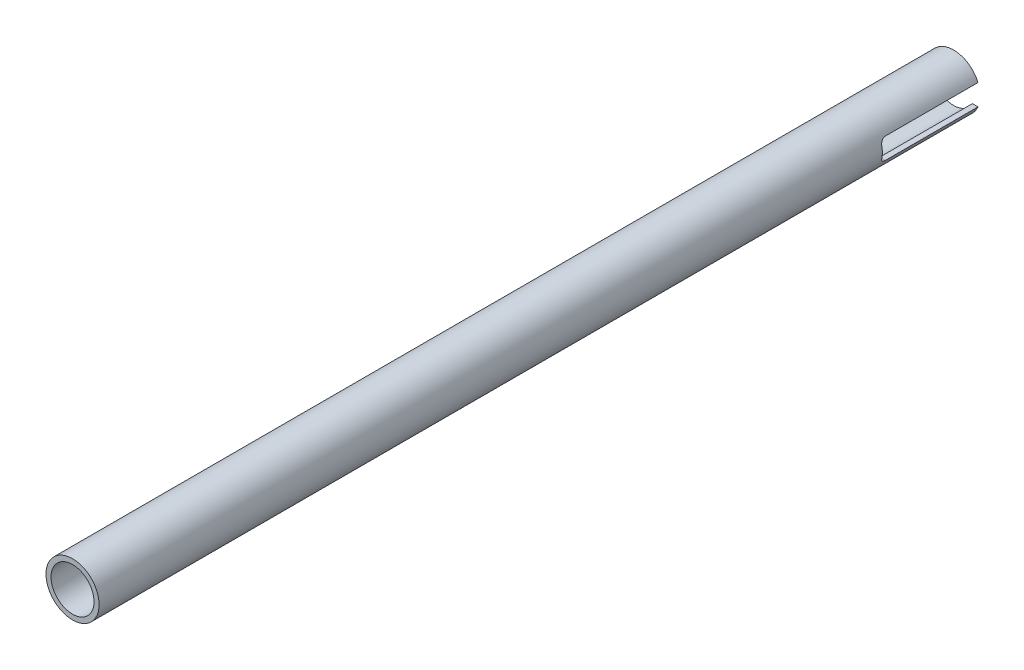
ISO-10303-21;
HEADER;
FILE_DESCRIPTION(('STEP AP214'),'2;1');
FILE_NAME('part.step','',(''),(''),'','','');
FILE_SCHEMA(('AUTOMOTIVE_DESIGN { 1 0 10303 214 1 1 1 1 }'));
ENDSEC;
DATA;
#1=APPLICATION_CONTEXT('core data for automotive mechanical design processes');
#2=APPLICATION_PROTOCOL_DEFINITION('international standard','automotive_design',2000,#1);
#3=PRODUCT_CONTEXT('',#1,'mechanical');
#4=PRODUCT('Part','Part','',(#3));
#5=PRODUCT_RELATED_PRODUCT_CATEGORY('part','',(#4));
#6=PRODUCT_DEFINITION_FORMATION('','',#4);
#7=PRODUCT_DEFINITION_CONTEXT('part definition',#1,'design');
#8=PRODUCT_DEFINITION('design','',#6,#7);
#9=PRODUCT_DEFINITION_SHAPE('','',#8);
#10=(LENGTH_UNIT() NAMED_UNIT(*) SI_UNIT(.MILLI.,.METRE.));
#11=(NAMED_UNIT(*) PLANE_ANGLE_UNIT() SI_UNIT($,.RADIAN.));
#12=(NAMED_UNIT(*) SI_UNIT($,.STERADIAN.) SOLID_ANGLE_UNIT());
#13=UNCERTAINTY_MEASURE_WITH_UNIT(LENGTH_MEASURE(1.E-05),#10,'distance_accuracy_value','');
#14=(GEOMETRIC_REPRESENTATION_CONTEXT(3) GLOBAL_UNCERTAINTY_ASSIGNED_CONTEXT((#13)) GLOBAL_UNIT_ASSIGNED_CONTEXT((#10,
#11,#12)) REPRESENTATION_CONTEXT('',''));
#15=CARTESIAN_POINT('',(0.,0.,0.));
#16=DIRECTION('',(0.,0.,1.));
#17=DIRECTION('',(1.,0.,0.));
#18=AXIS2_PLACEMENT_3D('',#15,#16,#17);
#19=CARTESIAN_POINT('',(0.,0.,0.));
#20=DIRECTION('',(0.,0.,1.));
#21=DIRECTION('',(1.,0.,0.));
#22=AXIS2_PLACEMENT_3D('',#19,#20,#21);
#23=PLANE('',#22);
#24=DIRECTION('',(-1.,0.,0.));
#25=VECTOR('',#24,1.);
#26=CARTESIAN_POINT('',(342.992458846044,-3.17500000000001,0.));
#27=LINE('',#26,#25);
#28=CARTESIAN_POINT('',(7.34407080575888,-3.17500000000001,0.));
#29=VERTEX_POINT('',#28);
#30=CARTESIAN_POINT('',(5.64543213580679,-3.17499999999999,0.));
#31=VERTEX_POINT('',#30);
#32=EDGE_CURVE('E63',#29,#31,#27,.T.);
#33=ORIENTED_EDGE('',*,*,#32,.F.);
#34=CARTESIAN_POINT('',(0.,0.,0.));
#35=DIRECTION('',(0.,0.,1.));
#36=DIRECTION('',(1.,0.,0.));
#37=AXIS2_PLACEMENT_3D('',#34,#35,#36);
#38=CIRCLE('',#37,8.001);
#39=CARTESIAN_POINT('',(-7.34407080575888,-3.17500000000001,0.));
#40=VERTEX_POINT('',#39);
#41=EDGE_CURVE('E152',#40,#29,#38,.T.);
#42=ORIENTED_EDGE('',*,*,#41,.F.);
#43=CARTESIAN_POINT('',(-5.64543213580682,-3.17500000000001,0.));
#44=VERTEX_POINT('',#43);
#45=EDGE_CURVE('E146',#44,#40,#27,.T.);
#46=ORIENTED_EDGE('',*,*,#45,.F.);
#47=CARTESIAN_POINT('',(0.,0.,0.));
#48=DIRECTION('',(0.,0.,1.));
#49=DIRECTION('',(1.,0.,0.));
#50=AXIS2_PLACEMENT_3D('',#47,#48,#49);
#51=CIRCLE('',#50,6.477);
#52=EDGE_CURVE('E248',#44,#31,#51,.T.);
#53=ORIENTED_EDGE('',*,*,#52,.T.);
#54=EDGE_LOOP('',(#33,#42,#46,#53));
#55=FACE_BOUND('',#54,.T.);
#56=ADVANCED_FACE('F39',(#55),#23,.F.);
#57=CARTESIAN_POINT('',(0.,0.,265.43));
#58=DIRECTION('',(0.,0.,-1.));
#59=DIRECTION('',(-1.,0.,0.));
#60=AXIS2_PLACEMENT_3D('',#57,#58,#59);
#61=CYLINDRICAL_SURFACE('',#60,8.001);
#62=CARTESIAN_POINT('',(0.,0.,265.43));
#63=DIRECTION('',(0.,0.,1.));
#64=DIRECTION('',(1.,0.,0.));
#65=AXIS2_PLACEMENT_3D('',#62,#63,#64);
#66=CIRCLE('',#65,8.001);
#67=CARTESIAN_POINT('',(8.001,0.,265.43));
#68=VERTEX_POINT('',#67);
#69=EDGE_CURVE('E255',#68,#68,#66,.T.);
#70=ORIENTED_EDGE('',*,*,#69,.F.);
#71=EDGE_LOOP('',(#70));
#72=FACE_BOUND('',#71,.T.);
#73=DIRECTION('',(0.,0.,-1.));
#74=VECTOR('',#73,1.);
#75=CARTESIAN_POINT('',(7.34407080575892,3.17499999999992,265.43));
#76=LINE('',#75,#74);
#77=CARTESIAN_POINT('',(7.34407080575894,3.175,0.));
#78=VERTEX_POINT('',#77);
#79=CARTESIAN_POINT('',(7.34407080575889,3.17499999999999,27.94));
#80=VERTEX_POINT('',#79);
#81=EDGE_CURVE('E244',#78,#80,#76,.F.);
#82=ORIENTED_EDGE('',*,*,#81,.F.);
#83=CARTESIAN_POINT('',(-7.34407080575894,3.175,0.));
#84=VERTEX_POINT('',#83);
#85=EDGE_CURVE('E259',#78,#84,#38,.T.);
#86=ORIENTED_EDGE('',*,*,#85,.T.);
#87=DIRECTION('',(0.,0.,-1.));
#88=VECTOR('',#87,1.);
#89=CARTESIAN_POINT('',(-7.34407080575892,3.17499999999992,265.43));
#90=LINE('',#89,#88);
#91=CARTESIAN_POINT('',(-7.34407080575889,3.17499999999999,27.94));
#92=VERTEX_POINT('',#91);
#93=EDGE_CURVE('E246',#92,#84,#90,.T.);
#94=ORIENTED_EDGE('',*,*,#93,.F.);
#95=CARTESIAN_POINT('',(-7.8288057837706,1.65099999999999,29.464));
#96=CARTESIAN_POINT('',(-7.81947795268345,1.69524181564514,29.4639996807889));
#97=CARTESIAN_POINT('',(-7.80977555287386,1.73937906238703,29.4620725755956));
#98=CARTESIAN_POINT('',(-7.7897053190962,1.82715995012294,29.4544259194222));
#99=CARTESIAN_POINT('',(-7.77933765259943,1.870803712116,29.4487073195399));
#100=CARTESIAN_POINT('',(-7.74740781787862,2.00038689143379,29.4259920832168));
#101=CARTESIAN_POINT('',(-7.72497172734663,2.08520038066884,29.4034353611242));
#102=CARTESIAN_POINT('',(-7.67879255624773,2.24931803273243,29.3443529357356));
#103=CARTESIAN_POINT('',(-7.65505009243317,2.32862475603218,29.307833776622));
#104=CARTESIAN_POINT('',(-7.60739952527334,2.47987144136615,29.2218403935313));
#105=CARTESIAN_POINT('',(-7.58349136309819,2.55180862700726,29.1723613118312));
#106=CARTESIAN_POINT('',(-7.53640113822511,2.68773877112478,29.0605553900397));
#107=CARTESIAN_POINT('',(-7.51324222932275,2.75155008701076,28.9979974672164));
#108=CARTESIAN_POINT('',(-7.46969556535498,2.86766507697724,28.8621080561482));
#109=CARTESIAN_POINT('',(-7.44930787514765,2.91996848174228,28.7887763158346));
#110=CARTESIAN_POINT('',(-7.41339882631975,3.00995182097469,28.635356056821));
#111=CARTESIAN_POINT('',(-7.39775949227146,3.04799299625044,28.555507568052));
#112=CARTESIAN_POINT('',(-7.37198636942665,3.10981595853761,28.3896963126839));
#113=CARTESIAN_POINT('',(-7.36184321814923,3.13362200161646,28.3037442276388));
#114=CARTESIAN_POINT('',(-7.35134082404798,3.15814271182933,28.170748149592));
#115=CARTESIAN_POINT('',(-7.34862226710174,3.16445643648463,28.1248527548858));
#116=CARTESIAN_POINT('',(-7.34498545577234,3.17288497032065,28.0326477775769));
#117=CARTESIAN_POINT('',(-7.34406565426136,3.17500338794749,27.9863385853611));
#118=CARTESIAN_POINT('',(-7.34407080575889,3.17499999999999,27.94));
#119=B_SPLINE_CURVE_WITH_KNOTS('',3,(#95,#96,#97,#98,#99,#100,#101,#102,#103,#104,#105,#106,
#107,#108,#109,#110,#111,#112,#113,#114,#115,#116,#117,#118),.UNSPECIFIED.,.F.,.F.,(4,2,2,2,2,2,
2,2,2,2,2,4),(0.,0.135553024626245,0.271072058592374,0.541437670457962,0.811676717226676,
1.08201720207601,1.35761362878683,1.63321650449497,1.90127196271359,2.16886935439239,
2.30789050122071,2.44679202186551),.UNSPECIFIED.);
#120=CARTESIAN_POINT('',(-7.8288057837706,1.65099999999999,29.464));
#121=VERTEX_POINT('',#120);
#122=EDGE_CURVE('E232',#121,#92,#119,.T.);
#123=ORIENTED_EDGE('',*,*,#122,.F.);
#124=CARTESIAN_POINT('',(0.,0.,29.464));
#125=DIRECTION('',(0.,0.,-1.));
#126=DIRECTION('',(-1.,0.,0.));
#127=AXIS2_PLACEMENT_3D('',#124,#125,#126);
#128=CIRCLE('',#127,8.001);
#129=CARTESIAN_POINT('',(-7.8288057837706,-1.651,29.464));
#130=VERTEX_POINT('',#129);
#131=EDGE_CURVE('E140',#130,#121,#128,.T.);
#132=ORIENTED_EDGE('',*,*,#131,.F.);
#133=CARTESIAN_POINT('',(-7.34407080575888,-3.175,27.94));
#134=CARTESIAN_POINT('',(-7.3440680096913,-3.17500157818638,27.9806984476088));
#135=CARTESIAN_POINT('',(-7.34477630214677,-3.17336860893187,28.0213759502433));
#136=CARTESIAN_POINT('',(-7.34758309143993,-3.16686635956913,28.102411407968));
#137=CARTESIAN_POINT('',(-7.34968118035477,-3.16199802907896,28.1427694533067));
#138=CARTESIAN_POINT('',(-7.35798857580184,-3.14264423927033,28.2626338560667));
#139=CARTESIAN_POINT('',(-7.36621159330718,-3.12340930879257,28.3412906881812));
#140=CARTESIAN_POINT('',(-7.38735918413182,-3.07305366060584,28.4938993996992));
#141=CARTESIAN_POINT('',(-7.40028060607282,-3.04194090905529,28.567854393813));
#142=CARTESIAN_POINT('',(-7.4298815779994,-2.96890708335138,28.7094453435949));
#143=CARTESIAN_POINT('',(-7.44656372650464,-2.92697853298672,28.7770768840646));
#144=CARTESIAN_POINT('',(-7.48338951433548,-2.83153727514407,28.9073193992745));
#145=CARTESIAN_POINT('',(-7.5036517696014,-2.77760154335605,28.9695861247467));
#146=CARTESIAN_POINT('',(-7.54586923311684,-2.66077336101834,29.0843978381578));
#147=CARTESIAN_POINT('',(-7.56782510086072,-2.59787741319581,29.1369390116058));
#148=CARTESIAN_POINT('',(-7.61377353576087,-2.46009532987571,29.23442490565));
#149=CARTESIAN_POINT('',(-7.63780327629239,-2.38468542927396,29.278613263246));
#150=CARTESIAN_POINT('',(-7.68517828309943,-2.22728162943213,29.3535295949975));
#151=CARTESIAN_POINT('',(-7.70852388215322,-2.14529100625114,29.3842642181982));
#152=CARTESIAN_POINT('',(-7.74866065435345,-1.99473307846588,29.4263269168587));
#153=CARTESIAN_POINT('',(-7.76579152458538,-1.9270088220366,29.4403889784846));
#154=CARTESIAN_POINT('',(-7.79853598216448,-1.78994063052702,29.4592336722557));
#155=CARTESIAN_POINT('',(-7.81414985826825,-1.7205970068191,29.4640180736839));
#156=CARTESIAN_POINT('',(-7.8288057837706,-1.651,29.464));
#157=B_SPLINE_CURVE_WITH_KNOTS('',3,(#133,#134,#135,#136,#137,#138,#139,#140,#141,#142,#143,
#144,#145,#146,#147,#148,#149,#150,#151,#152,#153,#154,#155,#156),.UNSPECIFIED.,.F.,.F.,(4,2,2,
2,2,2,2,2,2,2,2,4),(0.,0.12201561431295,0.243995431359554,0.486888996424004,0.729619944201783,
0.972519126749115,1.225937118326,1.47945429417213,1.75015649231414,2.02072475374975,
2.23388433321155,2.44700325838137),.UNSPECIFIED.);
#158=CARTESIAN_POINT('',(-7.34407080575888,-3.175,27.94));
#159=VERTEX_POINT('',#158);
#160=EDGE_CURVE('E141',#159,#130,#157,.T.);
#161=ORIENTED_EDGE('',*,*,#160,.F.);
#162=DIRECTION('',(0.,0.,-1.));
#163=VECTOR('',#162,1.);
#164=CARTESIAN_POINT('',(-7.34407080575889,-3.17499999999999,265.43));
#165=LINE('',#164,#163);
#166=EDGE_CURVE('E153',#40,#159,#165,.F.);
#167=ORIENTED_EDGE('',*,*,#166,.F.);
#168=ORIENTED_EDGE('',*,*,#41,.T.);
#169=DIRECTION('',(0.,0.,-1.));
#170=VECTOR('',#169,1.);
#171=CARTESIAN_POINT('',(7.34407080575889,-3.17499999999999,265.43));
#172=LINE('',#171,#170);
#173=CARTESIAN_POINT('',(7.34407080575888,-3.175,27.94));
#174=VERTEX_POINT('',#173);
#175=EDGE_CURVE('E144',#174,#29,#172,.T.);
#176=ORIENTED_EDGE('',*,*,#175,.F.);
#177=CARTESIAN_POINT('',(7.8288057837706,-1.651,29.464));
#178=CARTESIAN_POINT('',(7.81947795268344,-1.69524181564515,29.4639996807889));
#179=CARTESIAN_POINT('',(7.80977555287386,-1.73937906238705,29.4620725755956));
#180=CARTESIAN_POINT('',(7.78970531909619,-1.82715995012295,29.4544259194222));
#181=CARTESIAN_POINT('',(7.77933765259943,-1.87080371211601,29.4487073195399));
#182=CARTESIAN_POINT('',(7.74740781787862,-2.0003868914338,29.4259920832168));
#183=CARTESIAN_POINT('',(7.72497172734662,-2.08520038066886,29.4034353611242));
#184=CARTESIAN_POINT('',(7.67879255624773,-2.24931803273244,29.3443529357356));
#185=CARTESIAN_POINT('',(7.65505009243317,-2.32862475603219,29.307833776622));
#186=CARTESIAN_POINT('',(7.60739952527334,-2.47987144136616,29.2218403935313));
#187=CARTESIAN_POINT('',(7.58349136309819,-2.55180862700727,29.1723613118312));
#188=CARTESIAN_POINT('',(7.5364011382251,-2.6877387711248,29.0605553900397));
#189=CARTESIAN_POINT('',(7.51324222932275,-2.75155008701078,28.9979974672164));
#190=CARTESIAN_POINT('',(7.46969556535497,-2.86766507697726,28.8621080561482));
#191=CARTESIAN_POINT('',(7.44930787514765,-2.9199684817423,28.7887763158346));
#192=CARTESIAN_POINT('',(7.41339882631975,-3.0099518209747,28.635356056821));
#193=CARTESIAN_POINT('',(7.39775949227145,-3.04799299625045,28.555507568052));
#194=CARTESIAN_POINT('',(7.37198636942665,-3.10981595853763,28.3896963126839));
#195=CARTESIAN_POINT('',(7.36184321814923,-3.13362200161647,28.3037442276388));
#196=CARTESIAN_POINT('',(7.35134082404798,-3.15814271182935,28.170748149592));
#197=CARTESIAN_POINT('',(7.34862226710173,-3.16445643648464,28.1248527548858));
#198=CARTESIAN_POINT('',(7.34498545577233,-3.17288497032067,28.0326477775769));
#199=CARTESIAN_POINT('',(7.34406565426135,-3.17500338794751,27.9863385853611));
#200=CARTESIAN_POINT('',(7.34407080575888,-3.175,27.94));
#201=B_SPLINE_CURVE_WITH_KNOTS('',3,(#177,#178,#179,#180,#181,#182,#183,#184,#185,#186,#187,
#188,#189,#190,#191,#192,#193,#194,#195,#196,#197,#198,#199,#200),.UNSPECIFIED.,.F.,.F.,(4,2,2,
2,2,2,2,2,2,2,2,4),(0.,0.135553024626244,0.271072058592373,0.541437670457962,0.811676717226674,
1.08201720207601,1.35761362878684,1.63321650449498,1.9012719627136,2.16886935439239,
2.30789050122071,2.44679202186551),.UNSPECIFIED.);
#202=CARTESIAN_POINT('',(7.8288057837706,-1.651,29.464));
#203=VERTEX_POINT('',#202);
#204=EDGE_CURVE('E130',#203,#174,#201,.T.);
#205=ORIENTED_EDGE('',*,*,#204,.F.);
#206=CARTESIAN_POINT('',(7.8288057837706,1.65099999999999,29.464));
#207=VERTEX_POINT('',#206);
#208=EDGE_CURVE('E238',#207,#203,#128,.T.);
#209=ORIENTED_EDGE('',*,*,#208,.F.);
#210=CARTESIAN_POINT('',(7.34407080575889,3.17499999999999,27.94));
#211=CARTESIAN_POINT('',(7.34406800969131,3.17500157818637,27.9806984476088));
#212=CARTESIAN_POINT('',(7.34477630214678,3.17336860893186,28.0213759502433));
#213=CARTESIAN_POINT('',(7.34758309143993,3.16686635956911,28.102411407968));
#214=CARTESIAN_POINT('',(7.34968118035478,3.16199802907895,28.1427694533067));
#215=CARTESIAN_POINT('',(7.35798857580184,3.14264423927032,28.2626338560667));
#216=CARTESIAN_POINT('',(7.36621159330719,3.12340930879256,28.3412906881812));
#217=CARTESIAN_POINT('',(7.38735918413182,3.07305366060582,28.4938993996992));
#218=CARTESIAN_POINT('',(7.40028060607282,3.04194090905528,28.567854393813));
#219=CARTESIAN_POINT('',(7.4298815779994,2.96890708335136,28.7094453435949));
#220=CARTESIAN_POINT('',(7.44656372650465,2.92697853298671,28.7770768840646));
#221=CARTESIAN_POINT('',(7.48338951433549,2.83153727514406,28.9073193992745));
#222=CARTESIAN_POINT('',(7.50365176960141,2.77760154335604,28.9695861247467));
#223=CARTESIAN_POINT('',(7.54586923311685,2.66077336101832,29.0843978381578));
#224=CARTESIAN_POINT('',(7.56782510086072,2.5978774131958,29.1369390116058));
#225=CARTESIAN_POINT('',(7.61377353576087,2.4600953298757,29.23442490565));
#226=CARTESIAN_POINT('',(7.6378032762924,2.38468542927395,29.278613263246));
#227=CARTESIAN_POINT('',(7.68517828309944,2.22728162943211,29.3535295949975));
#228=CARTESIAN_POINT('',(7.70852388215323,2.14529100625113,29.3842642181981));
#229=CARTESIAN_POINT('',(7.74866065435345,1.99473307846587,29.4263269168587));
#230=CARTESIAN_POINT('',(7.76579152458538,1.92700882203658,29.4403889784846));
#231=CARTESIAN_POINT('',(7.79853598216448,1.78994063052701,29.4592336722557));
#232=CARTESIAN_POINT('',(7.81414985826825,1.72059700681908,29.4640180736839));
#233=CARTESIAN_POINT('',(7.8288057837706,1.65099999999999,29.464));
#234=B_SPLINE_CURVE_WITH_KNOTS('',3,(#210,#211,#212,#213,#214,#215,#216,#217,#218,#219,#220,
#221,#222,#223,#224,#225,#226,#227,#228,#229,#230,#231,#232,#233),.UNSPECIFIED.,.F.,.F.,(4,2,2,
2,2,2,2,2,2,2,2,4),(0.,0.12201561431295,0.243995431359554,0.486888996424004,0.729619944201783,
0.972519126749115,1.22593711832599,1.47945429417213,1.75015649231413,2.02072475374975,
2.23388433321155,2.44700325838137),.UNSPECIFIED.);
#235=EDGE_CURVE('E237',#80,#207,#234,.T.);
#236=ORIENTED_EDGE('',*,*,#235,.F.);
#237=EDGE_LOOP('',(#82,#86,#94,#123,#132,#161,#167,#168,#176,#205,#209,#236));
#238=FACE_BOUND('',#237,.T.);
#239=ADVANCED_FACE('F41',(#72,#238),#61,.T.);
#240=CARTESIAN_POINT('',(0.,0.,265.43));
#241=DIRECTION('',(0.,0.,-1.));
#242=DIRECTION('',(-1.,0.,0.));
#243=AXIS2_PLACEMENT_3D('',#240,#241,#242);
#244=CYLINDRICAL_SURFACE('',#243,6.477);
#245=CARTESIAN_POINT('',(0.,0.,265.43));
#246=DIRECTION('',(0.,0.,1.));
#247=DIRECTION('',(1.,0.,0.));
#248=AXIS2_PLACEMENT_3D('',#245,#246,#247);
#249=CIRCLE('',#248,6.477);
#250=CARTESIAN_POINT('',(6.477,0.,265.43));
#251=VERTEX_POINT('',#250);
#252=EDGE_CURVE('E249',#251,#251,#249,.T.);
#253=ORIENTED_EDGE('',*,*,#252,.T.);
#254=EDGE_LOOP('',(#253));
#255=FACE_BOUND('',#254,.T.);
#256=CARTESIAN_POINT('',(5.64543213580682,3.175,0.));
#257=VERTEX_POINT('',#256);
#258=CARTESIAN_POINT('',(-5.64543213580682,3.175,0.));
#259=VERTEX_POINT('',#258);
#260=EDGE_CURVE('E252',#257,#259,#51,.T.);
#261=ORIENTED_EDGE('',*,*,#260,.F.);
#262=DIRECTION('',(0.,0.,-1.));
#263=VECTOR('',#262,1.);
#264=CARTESIAN_POINT('',(5.64543213580683,3.17499999999992,265.43));
#265=LINE('',#264,#263);
#266=CARTESIAN_POINT('',(5.64543213580679,3.17499999999999,27.94));
#267=VERTEX_POINT('',#266);
#268=EDGE_CURVE('E11',#257,#267,#265,.F.);
#269=ORIENTED_EDGE('',*,*,#268,.T.);
#270=CARTESIAN_POINT('',(5.64543213580679,3.17499999999999,27.94));
#271=CARTESIAN_POINT('',(5.64542798532432,3.17500253012491,27.9795022750384));
#272=CARTESIAN_POINT('',(5.64629676751123,3.17346305780188,28.0189831851797));
#273=CARTESIAN_POINT('',(5.64973489172762,3.16734010596934,28.097616333837));
#274=CARTESIAN_POINT('',(5.65230347216193,3.16275798971433,28.1367687115998));
#275=CARTESIAN_POINT('',(5.6624528235623,3.14457608288719,28.2529070155873));
#276=CARTESIAN_POINT('',(5.67247830845162,3.12653965087181,28.3290381879893));
#277=CARTESIAN_POINT('',(5.69814957474154,3.07950075965754,28.4766255007952));
#278=CARTESIAN_POINT('',(5.71378770060105,3.05051323473278,28.5480878532046));
#279=CARTESIAN_POINT('',(5.74949312759986,2.98267072120713,28.6850337996201));
#280=CARTESIAN_POINT('',(5.76956543427929,2.94380457356396,28.7505105176722));
#281=CARTESIAN_POINT('',(5.81427344287328,2.85454020484129,28.8783725064171));
#282=CARTESIAN_POINT('',(5.83912294015509,2.80355001313473,28.9402682413202));
#283=CARTESIAN_POINT('',(5.89090094280743,2.69305400468479,29.0549190340714));
#284=CARTESIAN_POINT('',(5.91783040535228,2.63354425646504,29.1076698468731));
#285=CARTESIAN_POINT('',(5.9754026920417,2.50037980782341,29.2083991647787));
#286=CARTESIAN_POINT('',(6.00613015030678,2.42589024924425,29.2552294493506));
#287=CARTESIAN_POINT('',(6.06685054178971,2.26977298542592,29.3354912659983));
#288=CARTESIAN_POINT('',(6.09684379767183,2.18814849062352,29.3689287868608));
#289=CARTESIAN_POINT('',(6.15068954263711,2.03135452128191,29.4177262918858));
#290=CARTESIAN_POINT('',(6.17481721444706,1.95685658409068,29.4349485076857));
#291=CARTESIAN_POINT('',(6.2208090046563,1.80539896583251,29.4581012531514));
#292=CARTESIAN_POINT('',(6.24267154884634,1.72843762073706,29.4640239790673));
#293=CARTESIAN_POINT('',(6.26304462701648,1.65099999999999,29.464));
#294=B_SPLINE_CURVE_WITH_KNOTS('',3,(#270,#271,#272,#273,#274,#275,#276,#277,#278,#279,#280,
#281,#282,#283,#284,#285,#286,#287,#288,#289,#290,#291,#292,#293),.UNSPECIFIED.,.F.,.F.,(4,2,2,
2,2,2,2,2,2,2,2,4),(0.,0.11842611788255,0.236799210795264,0.472172634307249,0.707226225252081,
0.942546525606805,1.19340365391803,1.44437691938388,1.72272641785955,2.0009513086068,
2.24064521780671,2.48050460661626),.UNSPECIFIED.);
#295=CARTESIAN_POINT('',(6.26304462701648,1.65099999999999,29.464));
#296=VERTEX_POINT('',#295);
#297=EDGE_CURVE('E48',#267,#296,#294,.T.);
#298=ORIENTED_EDGE('',*,*,#297,.T.);
#299=CARTESIAN_POINT('',(0.,0.,29.464));
#300=DIRECTION('',(0.,0.,-1.));
#301=DIRECTION('',(-1.,0.,0.));
#302=AXIS2_PLACEMENT_3D('',#299,#300,#301);
#303=CIRCLE('',#302,6.477);
#304=CARTESIAN_POINT('',(6.26304462701648,-1.651,29.464));
#305=VERTEX_POINT('',#304);
#306=EDGE_CURVE('E195',#296,#305,#303,.T.);
#307=ORIENTED_EDGE('',*,*,#306,.T.);
#308=CARTESIAN_POINT('',(6.26304462701648,-1.651,29.464));
#309=CARTESIAN_POINT('',(6.25119301356599,-1.69597019045451,29.4639996512927));
#310=CARTESIAN_POINT('',(6.23885805015263,-1.74078424361484,29.4620087653986));
#311=CARTESIAN_POINT('',(6.21333080831813,-1.82980515275705,29.454134138941));
#312=CARTESIAN_POINT('',(6.20013884930389,-1.87401222760585,29.4482518413062));
#313=CARTESIAN_POINT('',(6.15951133396887,-2.00506101361784,29.4249457970163));
#314=CARTESIAN_POINT('',(6.13094979172369,-2.09061085165534,29.4018617467996));
#315=CARTESIAN_POINT('',(6.07212151471614,-2.25578612168244,29.3416219603263));
#316=CARTESIAN_POINT('',(6.04185654214358,-2.33541748531391,29.3044805465843));
#317=CARTESIAN_POINT('',(5.98100165398782,-2.48713337520253,29.2171532445204));
#318=CARTESIAN_POINT('',(5.95041151302896,-2.55921223237762,29.1669576544588));
#319=CARTESIAN_POINT('',(5.88959770370069,-2.69629003214929,29.0527307014112));
#320=CARTESIAN_POINT('',(5.85942026108732,-2.76097278644595,28.9882938275107));
#321=CARTESIAN_POINT('',(5.80262181829034,-2.87843237174363,28.8479375307773));
#322=CARTESIAN_POINT('',(5.77600068690932,-2.93120964200445,28.7720185317567));
#323=CARTESIAN_POINT('',(5.72961508062246,-3.02084256755071,28.6138173863488));
#324=CARTESIAN_POINT('',(5.70961192114585,-3.05826802843451,28.5319300118511));
#325=CARTESIAN_POINT('',(5.67705818777086,-3.11828924116529,28.3615909438744));
#326=CARTESIAN_POINT('',(5.66448853762436,-3.14092296814996,28.2731567140417));
#327=CARTESIAN_POINT('',(5.65274801817815,-3.16196375608022,28.143042864781));
#328=CARTESIAN_POINT('',(5.65001234622036,-3.16684526064363,28.1026313476031));
#329=CARTESIAN_POINT('',(5.64635324825543,-3.17336296637714,28.0214890576694));
#330=CARTESIAN_POINT('',(5.64542881846813,-3.17500096508517,27.980758474312));
#331=CARTESIAN_POINT('',(5.64543213580679,-3.175,27.94));
#332=B_SPLINE_CURVE_WITH_KNOTS('',3,(#308,#309,#310,#311,#312,#313,#314,#315,#316,#317,#318,
#319,#320,#321,#322,#323,#324,#325,#326,#327,#328,#329,#330,#331),.UNSPECIFIED.,.F.,.F.,(4,2,2,
2,2,2,2,2,2,2,2,4),(0.,0.13941997674178,0.278788285754549,0.556665652257205,0.834260658887698,
1.11206256399923,1.39912695233711,1.68618074753331,1.96132294859871,2.23575596690123,
2.35800176569004,2.4801797973654),.UNSPECIFIED.);
#333=CARTESIAN_POINT('',(5.64543213580682,-3.175,27.94));
#334=VERTEX_POINT('',#333);
#335=EDGE_CURVE('E189',#305,#334,#332,.T.);
#336=ORIENTED_EDGE('',*,*,#335,.T.);
#337=DIRECTION('',(0.,0.,-1.));
#338=VECTOR('',#337,1.);
#339=CARTESIAN_POINT('',(5.64543213580679,-3.17499999999999,265.43));
#340=LINE('',#339,#338);
#341=EDGE_CURVE('E145',#334,#31,#340,.T.);
#342=ORIENTED_EDGE('',*,*,#341,.T.);
#343=ORIENTED_EDGE('',*,*,#52,.F.);
#344=DIRECTION('',(0.,0.,-1.));
#345=VECTOR('',#344,1.);
#346=CARTESIAN_POINT('',(-5.64543213580679,-3.17499999999999,265.43));
#347=LINE('',#346,#345);
#348=CARTESIAN_POINT('',(-5.64543213580679,-3.17499999999999,27.94));
#349=VERTEX_POINT('',#348);
#350=EDGE_CURVE('E258',#44,#349,#347,.F.);
#351=ORIENTED_EDGE('',*,*,#350,.T.);
#352=CARTESIAN_POINT('',(-5.64543213580679,-3.175,27.94));
#353=CARTESIAN_POINT('',(-5.64542798532432,-3.17500253012492,27.9795022750384));
#354=CARTESIAN_POINT('',(-5.64629676751122,-3.17346305780189,28.0189831851797));
#355=CARTESIAN_POINT('',(-5.64973489172761,-3.16734010596935,28.097616333837));
#356=CARTESIAN_POINT('',(-5.65230347216192,-3.16275798971435,28.1367687115998));
#357=CARTESIAN_POINT('',(-5.6624528235623,-3.1445760828872,28.2529070155873));
#358=CARTESIAN_POINT('',(-5.67247830845161,-3.12653965087182,28.3290381879893));
#359=CARTESIAN_POINT('',(-5.69814957474154,-3.07950075965756,28.4766255007952));
#360=CARTESIAN_POINT('',(-5.71378770060104,-3.05051323473279,28.5480878532046));
#361=CARTESIAN_POINT('',(-5.74949312759985,-2.98267072120715,28.6850337996201));
#362=CARTESIAN_POINT('',(-5.76956543427929,-2.94380457356397,28.7505105176722));
#363=CARTESIAN_POINT('',(-5.81427344287327,-2.8545402048413,28.8783725064171));
#364=CARTESIAN_POINT('',(-5.83912294015508,-2.80355001313474,28.9402682413202));
#365=CARTESIAN_POINT('',(-5.89090094280742,-2.69305400468481,29.0549190340714));
#366=CARTESIAN_POINT('',(-5.91783040535228,-2.63354425646506,29.1076698468731));
#367=CARTESIAN_POINT('',(-5.97540269204169,-2.50037980782343,29.2083991647787));
#368=CARTESIAN_POINT('',(-6.00613015030677,-2.42589024924427,29.2552294493506));
#369=CARTESIAN_POINT('',(-6.06685054178971,-2.26977298542593,29.3354912659983));
#370=CARTESIAN_POINT('',(-6.09684379767183,-2.18814849062354,29.3689287868608));
#371=CARTESIAN_POINT('',(-6.1506895426371,-2.03135452128192,29.4177262918858));
#372=CARTESIAN_POINT('',(-6.17481721444706,-1.95685658409069,29.4349485076857));
#373=CARTESIAN_POINT('',(-6.2208090046563,-1.80539896583253,29.4581012531514));
#374=CARTESIAN_POINT('',(-6.24267154884634,-1.72843762073707,29.4640239790673));
#375=CARTESIAN_POINT('',(-6.26304462701648,-1.651,29.464));
#376=B_SPLINE_CURVE_WITH_KNOTS('',3,(#352,#353,#354,#355,#356,#357,#358,#359,#360,#361,#362,
#363,#364,#365,#366,#367,#368,#369,#370,#371,#372,#373,#374,#375),.UNSPECIFIED.,.F.,.F.,(4,2,2,
2,2,2,2,2,2,2,2,4),(0.,0.11842611788255,0.236799210795268,0.472172634307249,0.707226225252081,
0.942546525606805,1.19340365391803,1.44437691938388,1.72272641785955,2.0009513086068,
2.24064521780671,2.48050460661626),.UNSPECIFIED.);
#377=CARTESIAN_POINT('',(-6.26304462701648,-1.651,29.464));
#378=VERTEX_POINT('',#377);
#379=EDGE_CURVE('E179',#349,#378,#376,.T.);
#380=ORIENTED_EDGE('',*,*,#379,.T.);
#381=CARTESIAN_POINT('',(-6.26304462701648,1.65099999999999,29.464));
#382=VERTEX_POINT('',#381);
#383=EDGE_CURVE('E220',#378,#382,#303,.T.);
#384=ORIENTED_EDGE('',*,*,#383,.T.);
#385=CARTESIAN_POINT('',(-6.26304462701648,1.65099999999999,29.464));
#386=CARTESIAN_POINT('',(-6.251193013566,1.6959701904545,29.4639996512927));
#387=CARTESIAN_POINT('',(-6.23885805015264,1.74078424361482,29.4620087653986));
#388=CARTESIAN_POINT('',(-6.21333080831813,1.82980515275704,29.454134138941));
#389=CARTESIAN_POINT('',(-6.20013884930389,1.87401222760583,29.4482518413062));
#390=CARTESIAN_POINT('',(-6.15951133396887,2.00506101361782,29.4249457970163));
#391=CARTESIAN_POINT('',(-6.1309497917237,2.09061085165533,29.4018617467996));
#392=CARTESIAN_POINT('',(-6.07212151471614,2.25578612168242,29.3416219603263));
#393=CARTESIAN_POINT('',(-6.04185654214358,2.3354174853139,29.3044805465843));
#394=CARTESIAN_POINT('',(-5.98100165398783,2.48713337520252,29.2171532445204));
#395=CARTESIAN_POINT('',(-5.95041151302897,2.5592122323776,29.1669576544588));
#396=CARTESIAN_POINT('',(-5.8895977037007,2.69629003214927,29.0527307014112));
#397=CARTESIAN_POINT('',(-5.85942026108733,2.76097278644594,28.9882938275107));
#398=CARTESIAN_POINT('',(-5.80262181829034,2.87843237174362,28.8479375307773));
#399=CARTESIAN_POINT('',(-5.77600068690933,2.93120964200444,28.7720185317567));
#400=CARTESIAN_POINT('',(-5.72961508062246,3.02084256755069,28.6138173863488));
#401=CARTESIAN_POINT('',(-5.70961192114586,3.0582680284345,28.5319300118511));
#402=CARTESIAN_POINT('',(-5.67705818777087,3.11828924116528,28.3615909438744));
#403=CARTESIAN_POINT('',(-5.66448853762437,3.14092296814994,28.2731567140417));
#404=CARTESIAN_POINT('',(-5.65274801817816,3.16196375608021,28.143042864781));
#405=CARTESIAN_POINT('',(-5.65001234622037,3.16684526064362,28.1026313476031));
#406=CARTESIAN_POINT('',(-5.64635324825544,3.17336296637713,28.0214890576694));
#407=CARTESIAN_POINT('',(-5.64542881846814,3.17500096508516,27.980758474312));
#408=CARTESIAN_POINT('',(-5.6454321358068,3.17499999999999,27.94));
#409=B_SPLINE_CURVE_WITH_KNOTS('',3,(#385,#386,#387,#388,#389,#390,#391,#392,#393,#394,#395,
#396,#397,#398,#399,#400,#401,#402,#403,#404,#405,#406,#407,#408),.UNSPECIFIED.,.F.,.F.,(4,2,2,
2,2,2,2,2,2,2,2,4),(0.,0.13941997674178,0.278788285754548,0.556665652257204,0.834260658887697,
1.11206256399923,1.39912695233711,1.68618074753331,1.9613229485987,2.23575596690122,
2.35800176569004,2.4801797973654),.UNSPECIFIED.);
#410=CARTESIAN_POINT('',(-5.64543213580679,3.17499999999999,27.94));
#411=VERTEX_POINT('',#410);
#412=EDGE_CURVE('E213',#382,#411,#409,.T.);
#413=ORIENTED_EDGE('',*,*,#412,.T.);
#414=DIRECTION('',(0.,0.,-1.));
#415=VECTOR('',#414,1.);
#416=CARTESIAN_POINT('',(-5.64543213580683,3.17499999999992,265.43));
#417=LINE('',#416,#415);
#418=EDGE_CURVE('E219',#411,#259,#417,.T.);
#419=ORIENTED_EDGE('',*,*,#418,.T.);
#420=EDGE_LOOP('',(#261,#269,#298,#307,#336,#342,#343,#351,#380,#384,#413,#419));
#421=FACE_BOUND('',#420,.T.);
#422=ADVANCED_FACE('F201',(#255,#421),#244,.F.);
#423=CARTESIAN_POINT('',(0.,0.,265.43));
#424=DIRECTION('',(0.,0.,1.));
#425=DIRECTION('',(1.,0.,0.));
#426=AXIS2_PLACEMENT_3D('',#423,#424,#425);
#427=PLANE('',#426);
#428=ORIENTED_EDGE('',*,*,#69,.T.);
#429=EDGE_LOOP('',(#428));
#430=FACE_BOUND('',#429,.T.);
#431=ORIENTED_EDGE('',*,*,#252,.F.);
#432=EDGE_LOOP('',(#431));
#433=FACE_BOUND('',#432,.T.);
#434=ADVANCED_FACE('F206',(#430,#433),#427,.T.);
#435=ORIENTED_EDGE('',*,*,#85,.F.);
#436=DIRECTION('',(-1.,0.,0.));
#437=VECTOR('',#436,1.);
#438=CARTESIAN_POINT('',(342.992458846044,3.175,0.));
#439=LINE('',#438,#437);
#440=EDGE_CURVE('E156',#78,#257,#439,.T.);
#441=ORIENTED_EDGE('',*,*,#440,.T.);
#442=ORIENTED_EDGE('',*,*,#260,.T.);
#443=EDGE_CURVE('E278',#259,#84,#439,.T.);
#444=ORIENTED_EDGE('',*,*,#443,.T.);
#445=EDGE_LOOP('',(#435,#441,#442,#444));
#446=FACE_BOUND('',#445,.T.);
#447=ADVANCED_FACE('F301',(#446),#23,.F.);
#448=CARTESIAN_POINT('',(342.992458846044,-3.175,27.94));
#449=DIRECTION('',(0.,1.,0.));
#450=DIRECTION('',(0.,0.,1.));
#451=AXIS2_PLACEMENT_3D('',#448,#449,#450);
#452=PLANE('',#451);
#453=ORIENTED_EDGE('',*,*,#45,.T.);
#454=ORIENTED_EDGE('',*,*,#166,.T.);
#455=DIRECTION('',(-1.,0.,0.));
#456=VECTOR('',#455,1.);
#457=CARTESIAN_POINT('',(342.992458846044,-3.175,27.94));
#458=LINE('',#457,#456);
#459=EDGE_CURVE('E55',#349,#159,#458,.T.);
#460=ORIENTED_EDGE('',*,*,#459,.F.);
#461=ORIENTED_EDGE('',*,*,#350,.F.);
#462=EDGE_LOOP('',(#453,#454,#460,#461));
#463=FACE_BOUND('',#462,.T.);
#464=ADVANCED_FACE('F291',(#463),#452,.T.);
#465=CARTESIAN_POINT('',(342.992458846044,-1.651,27.94));
#466=DIRECTION('',(-1.,0.,0.));
#467=DIRECTION('',(0.,0.,1.));
#468=AXIS2_PLACEMENT_3D('',#465,#466,#467);
#469=CYLINDRICAL_SURFACE('',#468,1.524);
#470=ORIENTED_EDGE('',*,*,#459,.T.);
#471=ORIENTED_EDGE('',*,*,#160,.T.);
#472=DIRECTION('',(-1.,0.,0.));
#473=VECTOR('',#472,1.);
#474=CARTESIAN_POINT('',(342.992458846044,-1.651,29.464));
#475=LINE('',#474,#473);
#476=EDGE_CURVE('E287',#378,#130,#475,.T.);
#477=ORIENTED_EDGE('',*,*,#476,.F.);
#478=ORIENTED_EDGE('',*,*,#379,.F.);
#479=EDGE_LOOP('',(#470,#471,#477,#478));
#480=FACE_BOUND('',#479,.T.);
#481=ADVANCED_FACE('F174',(#480),#469,.F.);
#482=CARTESIAN_POINT('',(342.992458846044,1.65099999999999,29.464));
#483=DIRECTION('',(0.,0.,-1.));
#484=DIRECTION('',(-1.,0.,0.));
#485=AXIS2_PLACEMENT_3D('',#482,#483,#484);
#486=PLANE('',#485);
#487=ORIENTED_EDGE('',*,*,#476,.T.);
#488=ORIENTED_EDGE('',*,*,#131,.T.);
#489=DIRECTION('',(-1.,0.,0.));
#490=VECTOR('',#489,1.);
#491=CARTESIAN_POINT('',(342.992458846044,1.65099999999999,29.464));
#492=LINE('',#491,#490);
#493=EDGE_CURVE('E284',#382,#121,#492,.T.);
#494=ORIENTED_EDGE('',*,*,#493,.F.);
#495=ORIENTED_EDGE('',*,*,#383,.F.);
#496=EDGE_LOOP('',(#487,#488,#494,#495));
#497=FACE_BOUND('',#496,.T.);
#498=ADVANCED_FACE('F306',(#497),#486,.T.);
#499=CARTESIAN_POINT('',(342.992458846044,1.65099999999999,27.94));
#500=DIRECTION('',(-1.,0.,0.));
#501=DIRECTION('',(0.,0.,1.));
#502=AXIS2_PLACEMENT_3D('',#499,#500,#501);
#503=CYLINDRICAL_SURFACE('',#502,1.524);
#504=ORIENTED_EDGE('',*,*,#493,.T.);
#505=ORIENTED_EDGE('',*,*,#122,.T.);
#506=DIRECTION('',(-1.,0.,0.));
#507=VECTOR('',#506,1.);
#508=CARTESIAN_POINT('',(342.992458846044,3.17499999999999,27.94));
#509=LINE('',#508,#507);
#510=EDGE_CURVE('E279',#411,#92,#509,.T.);
#511=ORIENTED_EDGE('',*,*,#510,.F.);
#512=ORIENTED_EDGE('',*,*,#412,.F.);
#513=EDGE_LOOP('',(#504,#505,#511,#512));
#514=FACE_BOUND('',#513,.T.);
#515=ADVANCED_FACE('F226',(#514),#503,.F.);
#516=CARTESIAN_POINT('',(342.992458846044,3.175,0.));
#517=DIRECTION('',(0.,-1.,0.));
#518=DIRECTION('',(0.,0.,-1.));
#519=AXIS2_PLACEMENT_3D('',#516,#517,#518);
#520=PLANE('',#519);
#521=ORIENTED_EDGE('',*,*,#510,.T.);
#522=ORIENTED_EDGE('',*,*,#93,.T.);
#523=ORIENTED_EDGE('',*,*,#443,.F.);
#524=ORIENTED_EDGE('',*,*,#418,.F.);
#525=EDGE_LOOP('',(#521,#522,#523,#524));
#526=FACE_BOUND('',#525,.T.);
#527=ADVANCED_FACE('F208',(#526),#520,.T.);
#528=ORIENTED_EDGE('',*,*,#440,.F.);
#529=ORIENTED_EDGE('',*,*,#81,.T.);
#530=EDGE_CURVE('E272',#80,#267,#509,.T.);
#531=ORIENTED_EDGE('',*,*,#530,.T.);
#532=ORIENTED_EDGE('',*,*,#268,.F.);
#533=EDGE_LOOP('',(#528,#529,#531,#532));
#534=FACE_BOUND('',#533,.T.);
#535=ADVANCED_FACE('F224',(#534),#520,.T.);
#536=ORIENTED_EDGE('',*,*,#530,.F.);
#537=ORIENTED_EDGE('',*,*,#235,.T.);
#538=EDGE_CURVE('E275',#207,#296,#492,.T.);
#539=ORIENTED_EDGE('',*,*,#538,.T.);
#540=ORIENTED_EDGE('',*,*,#297,.F.);
#541=EDGE_LOOP('',(#536,#537,#539,#540));
#542=FACE_BOUND('',#541,.T.);
#543=ADVANCED_FACE('F221',(#542),#503,.F.);
#544=ORIENTED_EDGE('',*,*,#538,.F.);
#545=ORIENTED_EDGE('',*,*,#208,.T.);
#546=EDGE_CURVE('E136',#203,#305,#475,.T.);
#547=ORIENTED_EDGE('',*,*,#546,.T.);
#548=ORIENTED_EDGE('',*,*,#306,.F.);
#549=EDGE_LOOP('',(#544,#545,#547,#548));
#550=FACE_BOUND('',#549,.T.);
#551=ADVANCED_FACE('F173',(#550),#486,.T.);
#552=ORIENTED_EDGE('',*,*,#546,.F.);
#553=ORIENTED_EDGE('',*,*,#204,.T.);
#554=EDGE_CURVE('E133',#174,#334,#458,.T.);
#555=ORIENTED_EDGE('',*,*,#554,.T.);
#556=ORIENTED_EDGE('',*,*,#335,.F.);
#557=EDGE_LOOP('',(#552,#553,#555,#556));
#558=FACE_BOUND('',#557,.T.);
#559=ADVANCED_FACE('F132',(#558),#469,.F.);
#560=ORIENTED_EDGE('',*,*,#554,.F.);
#561=ORIENTED_EDGE('',*,*,#175,.T.);
#562=ORIENTED_EDGE('',*,*,#32,.T.);
#563=ORIENTED_EDGE('',*,*,#341,.F.);
#564=EDGE_LOOP('',(#560,#561,#562,#563));
#565=FACE_BOUND('',#564,.T.);
#566=ADVANCED_FACE('F143',(#565),#452,.T.);
#567=CLOSED_SHELL('',(#56,#239,#422,#434,#447,#464,#481,#498,#515,#527,#535,#543,#551,#559,#566));
#568=MANIFOLD_SOLID_BREP('B2',#567);
#569=ADVANCED_BREP_SHAPE_REPRESENTATION('',(#18,#568),#14);
#570=SHAPE_DEFINITION_REPRESENTATION(#9,#569);
ENDSEC;
END-ISO-10303-21;
